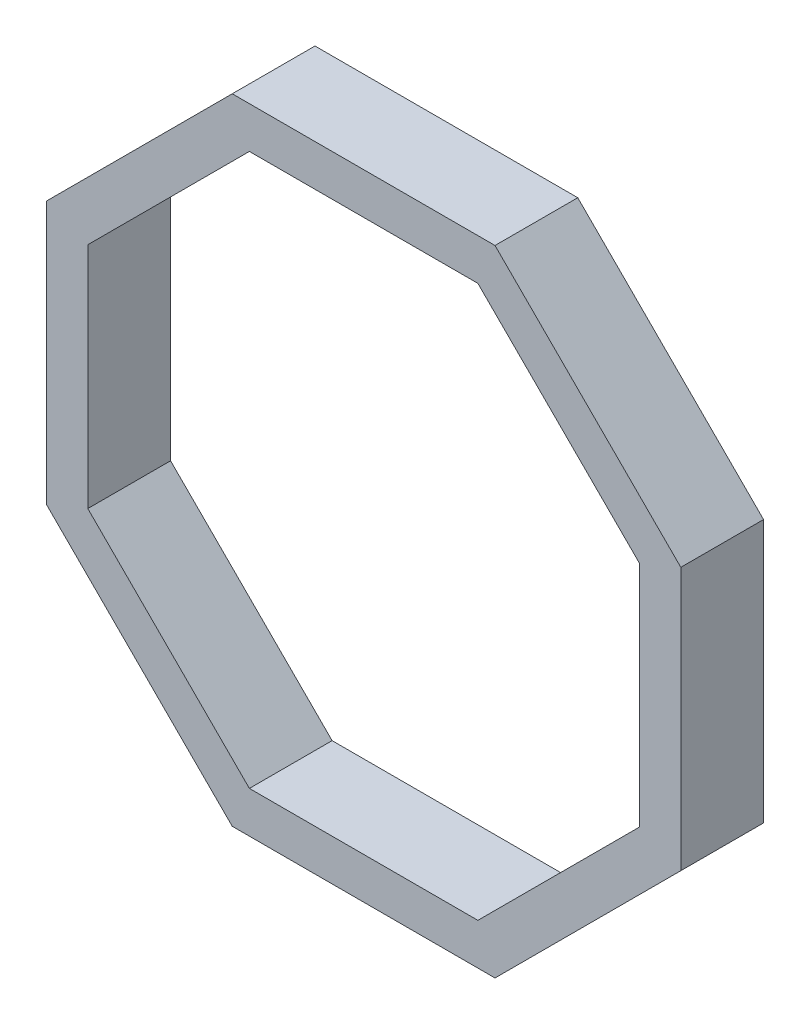
ISO-10303-21;
HEADER;
FILE_DESCRIPTION(('STEP AP214'),'2;1');
FILE_NAME('part.step','',(''),(''),'','','');
FILE_SCHEMA(('AUTOMOTIVE_DESIGN { 1 0 10303 214 1 1 1 1 }'));
ENDSEC;
DATA;
#1=APPLICATION_CONTEXT('core data for automotive mechanical design processes');
#2=APPLICATION_PROTOCOL_DEFINITION('international standard','automotive_design',2000,#1);
#3=PRODUCT_CONTEXT('',#1,'mechanical');
#4=PRODUCT('Part','Part','',(#3));
#5=PRODUCT_RELATED_PRODUCT_CATEGORY('part','',(#4));
#6=PRODUCT_DEFINITION_FORMATION('','',#4);
#7=PRODUCT_DEFINITION_CONTEXT('part definition',#1,'design');
#8=PRODUCT_DEFINITION('design','',#6,#7);
#9=PRODUCT_DEFINITION_SHAPE('','',#8);
#10=(LENGTH_UNIT() NAMED_UNIT(*) SI_UNIT(.MILLI.,.METRE.));
#11=(NAMED_UNIT(*) PLANE_ANGLE_UNIT() SI_UNIT($,.RADIAN.));
#12=(NAMED_UNIT(*) SI_UNIT($,.STERADIAN.) SOLID_ANGLE_UNIT());
#13=UNCERTAINTY_MEASURE_WITH_UNIT(LENGTH_MEASURE(1.E-05),#10,'distance_accuracy_value','');
#14=(GEOMETRIC_REPRESENTATION_CONTEXT(3) GLOBAL_UNCERTAINTY_ASSIGNED_CONTEXT((#13)) GLOBAL_UNIT_ASSIGNED_CONTEXT((#10,
#11,#12)) REPRESENTATION_CONTEXT('',''));
#15=CARTESIAN_POINT('',(0.,0.,0.));
#16=DIRECTION('',(0.,0.,1.));
#17=DIRECTION('',(1.,0.,0.));
#18=AXIS2_PLACEMENT_3D('',#15,#16,#17);
#19=CARTESIAN_POINT('',(0.,0.,30.));
#20=DIRECTION('',(0.,0.,1.));
#21=DIRECTION('',(1.,0.,0.));
#22=AXIS2_PLACEMENT_3D('',#19,#20,#21);
#23=PLANE('',#22);
#24=DIRECTION('',(0.,1.,0.));
#25=VECTOR('',#24,1.);
#26=CARTESIAN_POINT('',(115.,-47.634559672906,30.));
#27=LINE('',#26,#25);
#28=CARTESIAN_POINT('',(115.,-47.634559672906,30.));
#29=VERTEX_POINT('',#28);
#30=CARTESIAN_POINT('',(115.,47.634559672906,30.));
#31=VERTEX_POINT('',#30);
#32=EDGE_CURVE('E211',#29,#31,#27,.T.);
#33=ORIENTED_EDGE('',*,*,#32,.T.);
#34=DIRECTION('',(-0.707106781186548,0.707106781186548,0.));
#35=VECTOR('',#34,1.);
#36=CARTESIAN_POINT('',(115.,47.634559672906,30.));
#37=LINE('',#36,#35);
#38=CARTESIAN_POINT('',(47.6345596729059,115.,30.));
#39=VERTEX_POINT('',#38);
#40=EDGE_CURVE('E214',#31,#39,#37,.T.);
#41=ORIENTED_EDGE('',*,*,#40,.T.);
#42=DIRECTION('',(-1.,0.,0.));
#43=VECTOR('',#42,1.);
#44=CARTESIAN_POINT('',(47.6345596729059,115.,30.));
#45=LINE('',#44,#43);
#46=CARTESIAN_POINT('',(-47.634559672906,115.,30.));
#47=VERTEX_POINT('',#46);
#48=EDGE_CURVE('E217',#39,#47,#45,.T.);
#49=ORIENTED_EDGE('',*,*,#48,.T.);
#50=DIRECTION('',(-0.707106781186547,-0.707106781186548,0.));
#51=VECTOR('',#50,1.);
#52=CARTESIAN_POINT('',(-47.634559672906,115.,30.));
#53=LINE('',#52,#51);
#54=CARTESIAN_POINT('',(-115.,47.634559672906,30.));
#55=VERTEX_POINT('',#54);
#56=EDGE_CURVE('E219',#47,#55,#53,.T.);
#57=ORIENTED_EDGE('',*,*,#56,.T.);
#58=DIRECTION('',(0.,-1.,0.));
#59=VECTOR('',#58,1.);
#60=CARTESIAN_POINT('',(-115.,47.634559672906,30.));
#61=LINE('',#60,#59);
#62=CARTESIAN_POINT('',(-115.,-47.634559672906,30.));
#63=VERTEX_POINT('',#62);
#64=EDGE_CURVE('E221',#55,#63,#61,.T.);
#65=ORIENTED_EDGE('',*,*,#64,.T.);
#66=DIRECTION('',(0.707106781186547,-0.707106781186547,0.));
#67=VECTOR('',#66,1.);
#68=CARTESIAN_POINT('',(-115.,-47.634559672906,30.));
#69=LINE('',#68,#67);
#70=CARTESIAN_POINT('',(-47.634559672906,-115.,30.));
#71=VERTEX_POINT('',#70);
#72=EDGE_CURVE('E223',#63,#71,#69,.T.);
#73=ORIENTED_EDGE('',*,*,#72,.T.);
#74=DIRECTION('',(1.,0.,0.));
#75=VECTOR('',#74,1.);
#76=CARTESIAN_POINT('',(-47.634559672906,-115.,30.));
#77=LINE('',#76,#75);
#78=CARTESIAN_POINT('',(47.634559672906,-115.,30.));
#79=VERTEX_POINT('',#78);
#80=EDGE_CURVE('E225',#71,#79,#77,.T.);
#81=ORIENTED_EDGE('',*,*,#80,.T.);
#82=DIRECTION('',(0.707106781186548,0.707106781186547,0.));
#83=VECTOR('',#82,1.);
#84=CARTESIAN_POINT('',(47.634559672906,-115.,30.));
#85=LINE('',#84,#83);
#86=EDGE_CURVE('E227',#79,#29,#85,.T.);
#87=ORIENTED_EDGE('',*,*,#86,.T.);
#88=EDGE_LOOP('',(#33,#41,#49,#57,#65,#73,#81,#87));
#89=FACE_BOUND('',#88,.T.);
#90=DIRECTION('',(-0.707106781186549,0.707106781186546,0.));
#91=VECTOR('',#90,1.);
#92=CARTESIAN_POINT('',(99.9999999999997,41.4213562373096,30.));
#93=LINE('',#92,#91);
#94=CARTESIAN_POINT('',(99.9999999999997,41.4213562373096,30.));
#95=VERTEX_POINT('',#94);
#96=CARTESIAN_POINT('',(41.4213562373092,99.9999999999998,30.));
#97=VERTEX_POINT('',#96);
#98=EDGE_CURVE('E154',#95,#97,#93,.T.);
#99=ORIENTED_EDGE('',*,*,#98,.F.);
#100=DIRECTION('',(0.,1.,0.));
#101=VECTOR('',#100,1.);
#102=CARTESIAN_POINT('',(99.9999999999998,-41.4213562373093,30.));
#103=LINE('',#102,#101);
#104=CARTESIAN_POINT('',(99.9999999999998,-41.4213562373093,30.));
#105=VERTEX_POINT('',#104);
#106=EDGE_CURVE('E146',#105,#95,#103,.T.);
#107=ORIENTED_EDGE('',*,*,#106,.F.);
#108=DIRECTION('',(0.707106781186546,0.707106781186549,0.));
#109=VECTOR('',#108,1.);
#110=CARTESIAN_POINT('',(41.4213562373096,-99.9999999999997,30.));
#111=LINE('',#110,#109);
#112=CARTESIAN_POINT('',(41.4213562373096,-99.9999999999997,30.));
#113=VERTEX_POINT('',#112);
#114=EDGE_CURVE('E179',#113,#105,#111,.T.);
#115=ORIENTED_EDGE('',*,*,#114,.F.);
#116=DIRECTION('',(1.,0.,0.));
#117=VECTOR('',#116,1.);
#118=CARTESIAN_POINT('',(-41.4213562373093,-99.9999999999999,30.));
#119=LINE('',#118,#117);
#120=CARTESIAN_POINT('',(-41.4213562373093,-99.9999999999999,30.));
#121=VERTEX_POINT('',#120);
#122=EDGE_CURVE('E177',#121,#113,#119,.T.);
#123=ORIENTED_EDGE('',*,*,#122,.F.);
#124=DIRECTION('',(0.707106781186549,-0.707106781186546,0.));
#125=VECTOR('',#124,1.);
#126=CARTESIAN_POINT('',(-99.9999999999997,-41.4213562373096,30.));
#127=LINE('',#126,#125);
#128=CARTESIAN_POINT('',(-99.9999999999997,-41.4213562373096,30.));
#129=VERTEX_POINT('',#128);
#130=EDGE_CURVE('E175',#129,#121,#127,.T.);
#131=ORIENTED_EDGE('',*,*,#130,.F.);
#132=DIRECTION('',(0.,-1.,0.));
#133=VECTOR('',#132,1.);
#134=CARTESIAN_POINT('',(-99.9999999999999,41.4213562373092,30.));
#135=LINE('',#134,#133);
#136=CARTESIAN_POINT('',(-99.9999999999999,41.4213562373092,30.));
#137=VERTEX_POINT('',#136);
#138=EDGE_CURVE('E173',#137,#129,#135,.T.);
#139=ORIENTED_EDGE('',*,*,#138,.F.);
#140=DIRECTION('',(-0.707106781186546,-0.707106781186549,0.));
#141=VECTOR('',#140,1.);
#142=CARTESIAN_POINT('',(-41.4213562373096,99.9999999999997,30.));
#143=LINE('',#142,#141);
#144=CARTESIAN_POINT('',(-41.4213562373096,99.9999999999997,30.));
#145=VERTEX_POINT('',#144);
#146=EDGE_CURVE('E169',#145,#137,#143,.T.);
#147=ORIENTED_EDGE('',*,*,#146,.F.);
#148=DIRECTION('',(-1.,0.,0.));
#149=VECTOR('',#148,1.);
#150=CARTESIAN_POINT('',(41.4213562373092,99.9999999999998,30.));
#151=LINE('',#150,#149);
#152=EDGE_CURVE('E167',#97,#145,#151,.T.);
#153=ORIENTED_EDGE('',*,*,#152,.F.);
#154=EDGE_LOOP('',(#99,#107,#115,#123,#131,#139,#147,#153));
#155=FACE_BOUND('',#154,.T.);
#156=ADVANCED_FACE('F33',(#89,#155),#23,.T.);
#157=CARTESIAN_POINT('',(0.,0.,0.));
#158=DIRECTION('',(0.,0.,1.));
#159=DIRECTION('',(1.,0.,0.));
#160=AXIS2_PLACEMENT_3D('',#157,#158,#159);
#161=PLANE('',#160);
#162=DIRECTION('',(0.,1.,0.));
#163=VECTOR('',#162,1.);
#164=CARTESIAN_POINT('',(115.,-47.634559672906,0.));
#165=LINE('',#164,#163);
#166=CARTESIAN_POINT('',(115.,-47.634559672906,0.));
#167=VERTEX_POINT('',#166);
#168=CARTESIAN_POINT('',(115.,47.634559672906,0.));
#169=VERTEX_POINT('',#168);
#170=EDGE_CURVE('E162',#167,#169,#165,.T.);
#171=ORIENTED_EDGE('',*,*,#170,.F.);
#172=DIRECTION('',(0.707106781186548,0.707106781186547,0.));
#173=VECTOR('',#172,1.);
#174=CARTESIAN_POINT('',(47.634559672906,-115.,0.));
#175=LINE('',#174,#173);
#176=CARTESIAN_POINT('',(47.634559672906,-115.,0.));
#177=VERTEX_POINT('',#176);
#178=EDGE_CURVE('E215',#177,#167,#175,.T.);
#179=ORIENTED_EDGE('',*,*,#178,.F.);
#180=DIRECTION('',(1.,0.,0.));
#181=VECTOR('',#180,1.);
#182=CARTESIAN_POINT('',(-47.634559672906,-115.,0.));
#183=LINE('',#182,#181);
#184=CARTESIAN_POINT('',(-47.634559672906,-115.,0.));
#185=VERTEX_POINT('',#184);
#186=EDGE_CURVE('E242',#185,#177,#183,.T.);
#187=ORIENTED_EDGE('',*,*,#186,.F.);
#188=DIRECTION('',(0.707106781186547,-0.707106781186547,0.));
#189=VECTOR('',#188,1.);
#190=CARTESIAN_POINT('',(-115.,-47.634559672906,0.));
#191=LINE('',#190,#189);
#192=CARTESIAN_POINT('',(-115.,-47.634559672906,0.));
#193=VERTEX_POINT('',#192);
#194=EDGE_CURVE('E240',#193,#185,#191,.T.);
#195=ORIENTED_EDGE('',*,*,#194,.F.);
#196=DIRECTION('',(0.,-1.,0.));
#197=VECTOR('',#196,1.);
#198=CARTESIAN_POINT('',(-115.,47.634559672906,0.));
#199=LINE('',#198,#197);
#200=CARTESIAN_POINT('',(-115.,47.634559672906,0.));
#201=VERTEX_POINT('',#200);
#202=EDGE_CURVE('E238',#201,#193,#199,.T.);
#203=ORIENTED_EDGE('',*,*,#202,.F.);
#204=DIRECTION('',(-0.707106781186547,-0.707106781186548,0.));
#205=VECTOR('',#204,1.);
#206=CARTESIAN_POINT('',(-47.634559672906,115.,0.));
#207=LINE('',#206,#205);
#208=CARTESIAN_POINT('',(-47.634559672906,115.,0.));
#209=VERTEX_POINT('',#208);
#210=EDGE_CURVE('E236',#209,#201,#207,.T.);
#211=ORIENTED_EDGE('',*,*,#210,.F.);
#212=DIRECTION('',(-1.,0.,0.));
#213=VECTOR('',#212,1.);
#214=CARTESIAN_POINT('',(47.6345596729059,115.,0.));
#215=LINE('',#214,#213);
#216=CARTESIAN_POINT('',(47.6345596729059,115.,0.));
#217=VERTEX_POINT('',#216);
#218=EDGE_CURVE('E234',#217,#209,#215,.T.);
#219=ORIENTED_EDGE('',*,*,#218,.F.);
#220=DIRECTION('',(-0.707106781186548,0.707106781186548,0.));
#221=VECTOR('',#220,1.);
#222=CARTESIAN_POINT('',(115.,47.634559672906,0.));
#223=LINE('',#222,#221);
#224=EDGE_CURVE('E232',#169,#217,#223,.T.);
#225=ORIENTED_EDGE('',*,*,#224,.F.);
#226=EDGE_LOOP('',(#171,#179,#187,#195,#203,#211,#219,#225));
#227=FACE_BOUND('',#226,.T.);
#228=DIRECTION('',(0.,1.,0.));
#229=VECTOR('',#228,1.);
#230=CARTESIAN_POINT('',(99.9999999999998,-41.4213562373093,0.));
#231=LINE('',#230,#229);
#232=CARTESIAN_POINT('',(99.9999999999998,-41.4213562373093,0.));
#233=VERTEX_POINT('',#232);
#234=CARTESIAN_POINT('',(99.9999999999997,41.4213562373096,0.));
#235=VERTEX_POINT('',#234);
#236=EDGE_CURVE('E56',#233,#235,#231,.T.);
#237=ORIENTED_EDGE('',*,*,#236,.T.);
#238=DIRECTION('',(-0.707106781186549,0.707106781186546,0.));
#239=VECTOR('',#238,1.);
#240=CARTESIAN_POINT('',(99.9999999999997,41.4213562373096,0.));
#241=LINE('',#240,#239);
#242=CARTESIAN_POINT('',(41.4213562373092,99.9999999999998,0.));
#243=VERTEX_POINT('',#242);
#244=EDGE_CURVE('E161',#235,#243,#241,.T.);
#245=ORIENTED_EDGE('',*,*,#244,.T.);
#246=DIRECTION('',(-1.,0.,0.));
#247=VECTOR('',#246,1.);
#248=CARTESIAN_POINT('',(41.4213562373092,99.9999999999998,0.));
#249=LINE('',#248,#247);
#250=CARTESIAN_POINT('',(-41.4213562373096,99.9999999999997,0.));
#251=VERTEX_POINT('',#250);
#252=EDGE_CURVE('E183',#243,#251,#249,.T.);
#253=ORIENTED_EDGE('',*,*,#252,.T.);
#254=DIRECTION('',(-0.707106781186546,-0.707106781186549,0.));
#255=VECTOR('',#254,1.);
#256=CARTESIAN_POINT('',(-41.4213562373096,99.9999999999997,0.));
#257=LINE('',#256,#255);
#258=CARTESIAN_POINT('',(-99.9999999999999,41.4213562373092,0.));
#259=VERTEX_POINT('',#258);
#260=EDGE_CURVE('E186',#251,#259,#257,.T.);
#261=ORIENTED_EDGE('',*,*,#260,.T.);
#262=DIRECTION('',(0.,-1.,0.));
#263=VECTOR('',#262,1.);
#264=CARTESIAN_POINT('',(-99.9999999999999,41.4213562373092,0.));
#265=LINE('',#264,#263);
#266=CARTESIAN_POINT('',(-99.9999999999997,-41.4213562373096,0.));
#267=VERTEX_POINT('',#266);
#268=EDGE_CURVE('E189',#259,#267,#265,.T.);
#269=ORIENTED_EDGE('',*,*,#268,.T.);
#270=DIRECTION('',(0.707106781186549,-0.707106781186546,0.));
#271=VECTOR('',#270,1.);
#272=CARTESIAN_POINT('',(-99.9999999999997,-41.4213562373096,0.));
#273=LINE('',#272,#271);
#274=CARTESIAN_POINT('',(-41.4213562373093,-99.9999999999999,0.));
#275=VERTEX_POINT('',#274);
#276=EDGE_CURVE('E192',#267,#275,#273,.T.);
#277=ORIENTED_EDGE('',*,*,#276,.T.);
#278=DIRECTION('',(1.,0.,0.));
#279=VECTOR('',#278,1.);
#280=CARTESIAN_POINT('',(-41.4213562373093,-99.9999999999999,0.));
#281=LINE('',#280,#279);
#282=CARTESIAN_POINT('',(41.4213562373096,-99.9999999999997,0.));
#283=VERTEX_POINT('',#282);
#284=EDGE_CURVE('E195',#275,#283,#281,.T.);
#285=ORIENTED_EDGE('',*,*,#284,.T.);
#286=DIRECTION('',(0.707106781186546,0.707106781186549,0.));
#287=VECTOR('',#286,1.);
#288=CARTESIAN_POINT('',(41.4213562373096,-99.9999999999997,0.));
#289=LINE('',#288,#287);
#290=EDGE_CURVE('E155',#283,#233,#289,.T.);
#291=ORIENTED_EDGE('',*,*,#290,.T.);
#292=EDGE_LOOP('',(#237,#245,#253,#261,#269,#277,#285,#291));
#293=FACE_BOUND('',#292,.T.);
#294=ADVANCED_FACE('F272',(#227,#293),#161,.F.);
#295=CARTESIAN_POINT('',(115.,-47.634559672906,30.));
#296=DIRECTION('',(-1.,0.,0.));
#297=DIRECTION('',(0.,0.,1.));
#298=AXIS2_PLACEMENT_3D('',#295,#296,#297);
#299=PLANE('',#298);
#300=ORIENTED_EDGE('',*,*,#170,.T.);
#301=DIRECTION('',(0.,0.,-1.));
#302=VECTOR('',#301,1.);
#303=CARTESIAN_POINT('',(115.,47.634559672906,30.));
#304=LINE('',#303,#302);
#305=EDGE_CURVE('E11',#31,#169,#304,.T.);
#306=ORIENTED_EDGE('',*,*,#305,.F.);
#307=ORIENTED_EDGE('',*,*,#32,.F.);
#308=DIRECTION('',(0.,0.,-1.));
#309=VECTOR('',#308,1.);
#310=CARTESIAN_POINT('',(115.,-47.634559672906,30.));
#311=LINE('',#310,#309);
#312=EDGE_CURVE('E229',#29,#167,#311,.T.);
#313=ORIENTED_EDGE('',*,*,#312,.T.);
#314=EDGE_LOOP('',(#300,#306,#307,#313));
#315=FACE_BOUND('',#314,.T.);
#316=ADVANCED_FACE('F35',(#315),#299,.F.);
#317=CARTESIAN_POINT('',(115.,47.634559672906,30.));
#318=DIRECTION('',(-0.707106781186547,-0.707106781186547,0.));
#319=DIRECTION('',(0.707106781186548,-0.707106781186548,0.));
#320=AXIS2_PLACEMENT_3D('',#317,#318,#319);
#321=PLANE('',#320);
#322=ORIENTED_EDGE('',*,*,#224,.T.);
#323=DIRECTION('',(0.,0.,-1.));
#324=VECTOR('',#323,1.);
#325=CARTESIAN_POINT('',(47.6345596729059,115.,30.));
#326=LINE('',#325,#324);
#327=EDGE_CURVE('E41',#39,#217,#326,.T.);
#328=ORIENTED_EDGE('',*,*,#327,.F.);
#329=ORIENTED_EDGE('',*,*,#40,.F.);
#330=ORIENTED_EDGE('',*,*,#305,.T.);
#331=EDGE_LOOP('',(#322,#328,#329,#330));
#332=FACE_BOUND('',#331,.T.);
#333=ADVANCED_FACE('F289',(#332),#321,.F.);
#334=CARTESIAN_POINT('',(47.6345596729059,115.,30.));
#335=DIRECTION('',(0.,-1.,0.));
#336=DIRECTION('',(1.,0.,0.));
#337=AXIS2_PLACEMENT_3D('',#334,#335,#336);
#338=PLANE('',#337);
#339=ORIENTED_EDGE('',*,*,#218,.T.);
#340=DIRECTION('',(0.,0.,-1.));
#341=VECTOR('',#340,1.);
#342=CARTESIAN_POINT('',(-47.634559672906,115.,30.));
#343=LINE('',#342,#341);
#344=EDGE_CURVE('E259',#47,#209,#343,.T.);
#345=ORIENTED_EDGE('',*,*,#344,.F.);
#346=ORIENTED_EDGE('',*,*,#48,.F.);
#347=ORIENTED_EDGE('',*,*,#327,.T.);
#348=EDGE_LOOP('',(#339,#345,#346,#347));
#349=FACE_BOUND('',#348,.T.);
#350=ADVANCED_FACE('F266',(#349),#338,.F.);
#351=CARTESIAN_POINT('',(-47.634559672906,115.,30.));
#352=DIRECTION('',(0.707106781186548,-0.707106781186547,0.));
#353=DIRECTION('',(0.707106781186547,0.707106781186548,0.));
#354=AXIS2_PLACEMENT_3D('',#351,#352,#353);
#355=PLANE('',#354);
#356=ORIENTED_EDGE('',*,*,#210,.T.);
#357=DIRECTION('',(0.,0.,-1.));
#358=VECTOR('',#357,1.);
#359=CARTESIAN_POINT('',(-115.,47.634559672906,30.));
#360=LINE('',#359,#358);
#361=EDGE_CURVE('E256',#55,#201,#360,.T.);
#362=ORIENTED_EDGE('',*,*,#361,.F.);
#363=ORIENTED_EDGE('',*,*,#56,.F.);
#364=ORIENTED_EDGE('',*,*,#344,.T.);
#365=EDGE_LOOP('',(#356,#362,#363,#364));
#366=FACE_BOUND('',#365,.T.);
#367=ADVANCED_FACE('F278',(#366),#355,.F.);
#368=CARTESIAN_POINT('',(-115.,47.634559672906,30.));
#369=DIRECTION('',(1.,0.,0.));
#370=DIRECTION('',(0.,1.,0.));
#371=AXIS2_PLACEMENT_3D('',#368,#369,#370);
#372=PLANE('',#371);
#373=ORIENTED_EDGE('',*,*,#202,.T.);
#374=DIRECTION('',(0.,0.,-1.));
#375=VECTOR('',#374,1.);
#376=CARTESIAN_POINT('',(-115.,-47.634559672906,30.));
#377=LINE('',#376,#375);
#378=EDGE_CURVE('E253',#63,#193,#377,.T.);
#379=ORIENTED_EDGE('',*,*,#378,.F.);
#380=ORIENTED_EDGE('',*,*,#64,.F.);
#381=ORIENTED_EDGE('',*,*,#361,.T.);
#382=EDGE_LOOP('',(#373,#379,#380,#381));
#383=FACE_BOUND('',#382,.T.);
#384=ADVANCED_FACE('F282',(#383),#372,.F.);
#385=CARTESIAN_POINT('',(-115.,-47.634559672906,30.));
#386=DIRECTION('',(0.707106781186547,0.707106781186547,0.));
#387=DIRECTION('',(-0.707106781186548,0.707106781186548,0.));
#388=AXIS2_PLACEMENT_3D('',#385,#386,#387);
#389=PLANE('',#388);
#390=ORIENTED_EDGE('',*,*,#194,.T.);
#391=DIRECTION('',(0.,0.,-1.));
#392=VECTOR('',#391,1.);
#393=CARTESIAN_POINT('',(-47.634559672906,-115.,30.));
#394=LINE('',#393,#392);
#395=EDGE_CURVE('E250',#71,#185,#394,.T.);
#396=ORIENTED_EDGE('',*,*,#395,.F.);
#397=ORIENTED_EDGE('',*,*,#72,.F.);
#398=ORIENTED_EDGE('',*,*,#378,.T.);
#399=EDGE_LOOP('',(#390,#396,#397,#398));
#400=FACE_BOUND('',#399,.T.);
#401=ADVANCED_FACE('F302',(#400),#389,.F.);
#402=CARTESIAN_POINT('',(-47.634559672906,-115.,30.));
#403=DIRECTION('',(0.,1.,0.));
#404=DIRECTION('',(-1.,0.,0.));
#405=AXIS2_PLACEMENT_3D('',#402,#403,#404);
#406=PLANE('',#405);
#407=ORIENTED_EDGE('',*,*,#186,.T.);
#408=DIRECTION('',(0.,0.,-1.));
#409=VECTOR('',#408,1.);
#410=CARTESIAN_POINT('',(47.634559672906,-115.,30.));
#411=LINE('',#410,#409);
#412=EDGE_CURVE('E247',#79,#177,#411,.T.);
#413=ORIENTED_EDGE('',*,*,#412,.F.);
#414=ORIENTED_EDGE('',*,*,#80,.F.);
#415=ORIENTED_EDGE('',*,*,#395,.T.);
#416=EDGE_LOOP('',(#407,#413,#414,#415));
#417=FACE_BOUND('',#416,.T.);
#418=ADVANCED_FACE('F300',(#417),#406,.F.);
#419=CARTESIAN_POINT('',(47.634559672906,-115.,30.));
#420=DIRECTION('',(-0.707106781186547,0.707106781186548,0.));
#421=DIRECTION('',(-0.707106781186548,-0.707106781186547,0.));
#422=AXIS2_PLACEMENT_3D('',#419,#420,#421);
#423=PLANE('',#422);
#424=ORIENTED_EDGE('',*,*,#178,.T.);
#425=ORIENTED_EDGE('',*,*,#312,.F.);
#426=ORIENTED_EDGE('',*,*,#86,.F.);
#427=ORIENTED_EDGE('',*,*,#412,.T.);
#428=EDGE_LOOP('',(#424,#425,#426,#427));
#429=FACE_BOUND('',#428,.T.);
#430=ADVANCED_FACE('F295',(#429),#423,.F.);
#431=CARTESIAN_POINT('',(99.9999999999998,-41.4213562373093,30.));
#432=DIRECTION('',(-1.,0.,0.));
#433=DIRECTION('',(0.,-1.,0.));
#434=AXIS2_PLACEMENT_3D('',#431,#432,#433);
#435=PLANE('',#434);
#436=ORIENTED_EDGE('',*,*,#236,.F.);
#437=DIRECTION('',(0.,0.,-1.));
#438=VECTOR('',#437,1.);
#439=CARTESIAN_POINT('',(99.9999999999998,-41.4213562373093,30.));
#440=LINE('',#439,#438);
#441=EDGE_CURVE('E150',#105,#233,#440,.T.);
#442=ORIENTED_EDGE('',*,*,#441,.F.);
#443=ORIENTED_EDGE('',*,*,#106,.T.);
#444=DIRECTION('',(0.,0.,-1.));
#445=VECTOR('',#444,1.);
#446=CARTESIAN_POINT('',(99.9999999999997,41.4213562373096,30.));
#447=LINE('',#446,#445);
#448=EDGE_CURVE('E149',#95,#235,#447,.T.);
#449=ORIENTED_EDGE('',*,*,#448,.T.);
#450=EDGE_LOOP('',(#436,#442,#443,#449));
#451=FACE_BOUND('',#450,.T.);
#452=ADVANCED_FACE('F148',(#451),#435,.T.);
#453=CARTESIAN_POINT('',(99.9999999999997,41.4213562373096,30.));
#454=DIRECTION('',(-0.707106781186546,-0.707106781186549,0.));
#455=DIRECTION('',(0.707106781186549,-0.707106781186546,0.));
#456=AXIS2_PLACEMENT_3D('',#453,#454,#455);
#457=PLANE('',#456);
#458=ORIENTED_EDGE('',*,*,#244,.F.);
#459=ORIENTED_EDGE('',*,*,#448,.F.);
#460=ORIENTED_EDGE('',*,*,#98,.T.);
#461=DIRECTION('',(0.,0.,-1.));
#462=VECTOR('',#461,1.);
#463=CARTESIAN_POINT('',(41.4213562373092,99.9999999999998,30.));
#464=LINE('',#463,#462);
#465=EDGE_CURVE('E163',#97,#243,#464,.T.);
#466=ORIENTED_EDGE('',*,*,#465,.T.);
#467=EDGE_LOOP('',(#458,#459,#460,#466));
#468=FACE_BOUND('',#467,.T.);
#469=ADVANCED_FACE('F158',(#468),#457,.T.);
#470=CARTESIAN_POINT('',(41.4213562373092,99.9999999999998,30.));
#471=DIRECTION('',(0.,-1.,0.));
#472=DIRECTION('',(1.,0.,0.));
#473=AXIS2_PLACEMENT_3D('',#470,#471,#472);
#474=PLANE('',#473);
#475=ORIENTED_EDGE('',*,*,#252,.F.);
#476=ORIENTED_EDGE('',*,*,#465,.F.);
#477=ORIENTED_EDGE('',*,*,#152,.T.);
#478=DIRECTION('',(0.,0.,-1.));
#479=VECTOR('',#478,1.);
#480=CARTESIAN_POINT('',(-41.4213562373096,99.9999999999997,30.));
#481=LINE('',#480,#479);
#482=EDGE_CURVE('E208',#145,#251,#481,.T.);
#483=ORIENTED_EDGE('',*,*,#482,.T.);
#484=EDGE_LOOP('',(#475,#476,#477,#483));
#485=FACE_BOUND('',#484,.T.);
#486=ADVANCED_FACE('F327',(#485),#474,.T.);
#487=CARTESIAN_POINT('',(-41.4213562373096,99.9999999999997,30.));
#488=DIRECTION('',(0.707106781186549,-0.707106781186546,0.));
#489=DIRECTION('',(0.707106781186546,0.707106781186549,0.));
#490=AXIS2_PLACEMENT_3D('',#487,#488,#489);
#491=PLANE('',#490);
#492=ORIENTED_EDGE('',*,*,#260,.F.);
#493=ORIENTED_EDGE('',*,*,#482,.F.);
#494=ORIENTED_EDGE('',*,*,#146,.T.);
#495=DIRECTION('',(0.,0.,-1.));
#496=VECTOR('',#495,1.);
#497=CARTESIAN_POINT('',(-99.9999999999999,41.4213562373092,30.));
#498=LINE('',#497,#496);
#499=EDGE_CURVE('E206',#137,#259,#498,.T.);
#500=ORIENTED_EDGE('',*,*,#499,.T.);
#501=EDGE_LOOP('',(#492,#493,#494,#500));
#502=FACE_BOUND('',#501,.T.);
#503=ADVANCED_FACE('F331',(#502),#491,.T.);
#504=CARTESIAN_POINT('',(-99.9999999999999,41.4213562373092,30.));
#505=DIRECTION('',(1.,0.,0.));
#506=DIRECTION('',(0.,1.,0.));
#507=AXIS2_PLACEMENT_3D('',#504,#505,#506);
#508=PLANE('',#507);
#509=ORIENTED_EDGE('',*,*,#268,.F.);
#510=ORIENTED_EDGE('',*,*,#499,.F.);
#511=ORIENTED_EDGE('',*,*,#138,.T.);
#512=DIRECTION('',(0.,0.,-1.));
#513=VECTOR('',#512,1.);
#514=CARTESIAN_POINT('',(-99.9999999999997,-41.4213562373096,30.));
#515=LINE('',#514,#513);
#516=EDGE_CURVE('E204',#129,#267,#515,.T.);
#517=ORIENTED_EDGE('',*,*,#516,.T.);
#518=EDGE_LOOP('',(#509,#510,#511,#517));
#519=FACE_BOUND('',#518,.T.);
#520=ADVANCED_FACE('F337',(#519),#508,.T.);
#521=CARTESIAN_POINT('',(-99.9999999999997,-41.4213562373096,30.));
#522=DIRECTION('',(0.707106781186546,0.707106781186549,0.));
#523=DIRECTION('',(-0.707106781186549,0.707106781186546,0.));
#524=AXIS2_PLACEMENT_3D('',#521,#522,#523);
#525=PLANE('',#524);
#526=ORIENTED_EDGE('',*,*,#276,.F.);
#527=ORIENTED_EDGE('',*,*,#516,.F.);
#528=ORIENTED_EDGE('',*,*,#130,.T.);
#529=DIRECTION('',(0.,0.,-1.));
#530=VECTOR('',#529,1.);
#531=CARTESIAN_POINT('',(-41.4213562373093,-99.9999999999999,30.));
#532=LINE('',#531,#530);
#533=EDGE_CURVE('E202',#121,#275,#532,.T.);
#534=ORIENTED_EDGE('',*,*,#533,.T.);
#535=EDGE_LOOP('',(#526,#527,#528,#534));
#536=FACE_BOUND('',#535,.T.);
#537=ADVANCED_FACE('F341',(#536),#525,.T.);
#538=CARTESIAN_POINT('',(-41.4213562373093,-99.9999999999999,30.));
#539=DIRECTION('',(0.,1.,0.));
#540=DIRECTION('',(-1.,0.,0.));
#541=AXIS2_PLACEMENT_3D('',#538,#539,#540);
#542=PLANE('',#541);
#543=ORIENTED_EDGE('',*,*,#284,.F.);
#544=ORIENTED_EDGE('',*,*,#533,.F.);
#545=ORIENTED_EDGE('',*,*,#122,.T.);
#546=DIRECTION('',(0.,0.,-1.));
#547=VECTOR('',#546,1.);
#548=CARTESIAN_POINT('',(41.4213562373096,-99.9999999999997,30.));
#549=LINE('',#548,#547);
#550=EDGE_CURVE('E48',#113,#283,#549,.T.);
#551=ORIENTED_EDGE('',*,*,#550,.T.);
#552=EDGE_LOOP('',(#543,#544,#545,#551));
#553=FACE_BOUND('',#552,.T.);
#554=ADVANCED_FACE('F345',(#553),#542,.T.);
#555=CARTESIAN_POINT('',(41.4213562373096,-99.9999999999997,30.));
#556=DIRECTION('',(-0.707106781186549,0.707106781186546,0.));
#557=DIRECTION('',(-0.707106781186546,-0.707106781186549,0.));
#558=AXIS2_PLACEMENT_3D('',#555,#556,#557);
#559=PLANE('',#558);
#560=ORIENTED_EDGE('',*,*,#290,.F.);
#561=ORIENTED_EDGE('',*,*,#550,.F.);
#562=ORIENTED_EDGE('',*,*,#114,.T.);
#563=ORIENTED_EDGE('',*,*,#441,.T.);
#564=EDGE_LOOP('',(#560,#561,#562,#563));
#565=FACE_BOUND('',#564,.T.);
#566=ADVANCED_FACE('F349',(#565),#559,.T.);
#567=CLOSED_SHELL('',(#156,#294,#316,#333,#350,#367,#384,#401,#418,#430,#452,#469,#486,#503,
#520,#537,#554,#566));
#568=MANIFOLD_SOLID_BREP('B2',#567);
#569=ADVANCED_BREP_SHAPE_REPRESENTATION('',(#18,#568),#14);
#570=SHAPE_DEFINITION_REPRESENTATION(#9,#569);
ENDSEC;
END-ISO-10303-21;
